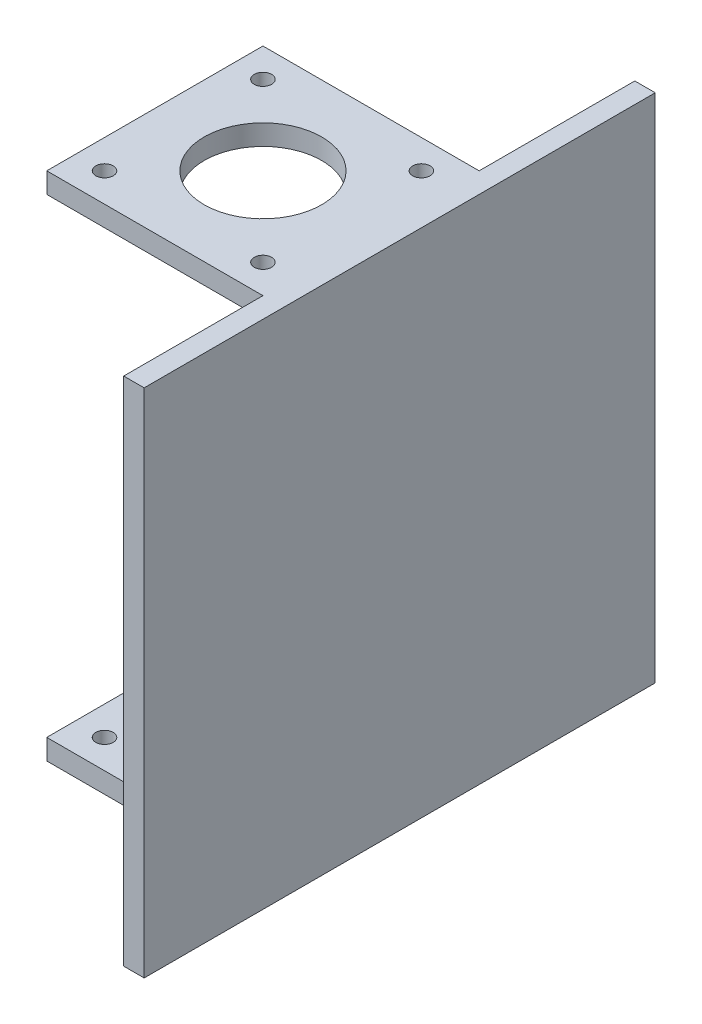
ISO-10303-21;
HEADER;
FILE_DESCRIPTION(('STEP AP214'),'2;1');
FILE_NAME('part.step','',(''),(''),'','','');
FILE_SCHEMA(('AUTOMOTIVE_DESIGN { 1 0 10303 214 1 1 1 1 }'));
ENDSEC;
DATA;
#1=APPLICATION_CONTEXT('core data for automotive mechanical design processes');
#2=APPLICATION_PROTOCOL_DEFINITION('international standard','automotive_design',2000,#1);
#3=PRODUCT_CONTEXT('',#1,'mechanical');
#4=PRODUCT('Part','Part','',(#3));
#5=PRODUCT_RELATED_PRODUCT_CATEGORY('part','',(#4));
#6=PRODUCT_DEFINITION_FORMATION('','',#4);
#7=PRODUCT_DEFINITION_CONTEXT('part definition',#1,'design');
#8=PRODUCT_DEFINITION('design','',#6,#7);
#9=PRODUCT_DEFINITION_SHAPE('','',#8);
#10=(LENGTH_UNIT() NAMED_UNIT(*) SI_UNIT(.MILLI.,.METRE.));
#11=(NAMED_UNIT(*) PLANE_ANGLE_UNIT() SI_UNIT($,.RADIAN.));
#12=(NAMED_UNIT(*) SI_UNIT($,.STERADIAN.) SOLID_ANGLE_UNIT());
#13=UNCERTAINTY_MEASURE_WITH_UNIT(LENGTH_MEASURE(1.E-05),#10,'distance_accuracy_value','');
#14=(GEOMETRIC_REPRESENTATION_CONTEXT(3) GLOBAL_UNCERTAINTY_ASSIGNED_CONTEXT((#13)) GLOBAL_UNIT_ASSIGNED_CONTEXT((#10,
#11,#12)) REPRESENTATION_CONTEXT('',''));
#15=CARTESIAN_POINT('',(0.,0.,0.));
#16=DIRECTION('',(0.,0.,1.));
#17=DIRECTION('',(1.,0.,0.));
#18=AXIS2_PLACEMENT_3D('',#15,#16,#17);
#19=CARTESIAN_POINT('',(21.15,0.,0.));
#20=DIRECTION('',(1.,0.,0.));
#21=DIRECTION('',(0.,0.,-1.));
#22=AXIS2_PLACEMENT_3D('',#19,#20,#21);
#23=PLANE('',#22);
#24=DIRECTION('',(0.,1.,0.));
#25=VECTOR('',#24,1.);
#26=CARTESIAN_POINT('',(21.15,-96.,21.15));
#27=LINE('',#26,#25);
#28=CARTESIAN_POINT('',(21.15,-96.,21.15));
#29=VERTEX_POINT('',#28);
#30=CARTESIAN_POINT('',(21.15,-92.,21.15));
#31=VERTEX_POINT('',#30);
#32=EDGE_CURVE('E149',#29,#31,#27,.T.);
#33=ORIENTED_EDGE('',*,*,#32,.F.);
#34=DIRECTION('',(0.,0.,-1.));
#35=VECTOR('',#34,1.);
#36=CARTESIAN_POINT('',(21.15,-96.,48.3941402757908));
#37=LINE('',#36,#35);
#38=CARTESIAN_POINT('',(21.15,-96.,48.3941402757908));
#39=VERTEX_POINT('',#38);
#40=EDGE_CURVE('E163',#39,#29,#37,.T.);
#41=ORIENTED_EDGE('',*,*,#40,.F.);
#42=DIRECTION('',(0.,-1.,0.));
#43=VECTOR('',#42,1.);
#44=CARTESIAN_POINT('',(21.15,4.,48.3941402757908));
#45=LINE('',#44,#43);
#46=CARTESIAN_POINT('',(21.15,4.,48.3941402757908));
#47=VERTEX_POINT('',#46);
#48=EDGE_CURVE('E168',#47,#39,#45,.T.);
#49=ORIENTED_EDGE('',*,*,#48,.F.);
#50=DIRECTION('',(0.,0.,1.));
#51=VECTOR('',#50,1.);
#52=CARTESIAN_POINT('',(21.15,4.,48.3941402757908));
#53=LINE('',#52,#51);
#54=CARTESIAN_POINT('',(21.15,4.,21.15));
#55=VERTEX_POINT('',#54);
#56=EDGE_CURVE('E177',#55,#47,#53,.T.);
#57=ORIENTED_EDGE('',*,*,#56,.F.);
#58=DIRECTION('',(0.,-1.,0.));
#59=VECTOR('',#58,1.);
#60=CARTESIAN_POINT('',(21.15,4.,21.15));
#61=LINE('',#60,#59);
#62=CARTESIAN_POINT('',(21.15,0.,21.15));
#63=VERTEX_POINT('',#62);
#64=EDGE_CURVE('E254',#55,#63,#61,.T.);
#65=ORIENTED_EDGE('',*,*,#64,.T.);
#66=DIRECTION('',(0.,0.,-1.));
#67=VECTOR('',#66,1.);
#68=CARTESIAN_POINT('',(21.15,0.,21.15));
#69=LINE('',#68,#67);
#70=CARTESIAN_POINT('',(21.15,0.,-21.15));
#71=VERTEX_POINT('',#70);
#72=EDGE_CURVE('E241',#63,#71,#69,.T.);
#73=ORIENTED_EDGE('',*,*,#72,.T.);
#74=DIRECTION('',(0.,-1.,0.));
#75=VECTOR('',#74,1.);
#76=CARTESIAN_POINT('',(21.15,4.,-21.15));
#77=LINE('',#76,#75);
#78=CARTESIAN_POINT('',(21.15,4.,-21.15));
#79=VERTEX_POINT('',#78);
#80=EDGE_CURVE('E11',#79,#71,#77,.T.);
#81=ORIENTED_EDGE('',*,*,#80,.F.);
#82=CARTESIAN_POINT('',(21.15,4.,-51.6058597242092));
#83=VERTEX_POINT('',#82);
#84=EDGE_CURVE('E183',#83,#79,#53,.T.);
#85=ORIENTED_EDGE('',*,*,#84,.F.);
#86=DIRECTION('',(0.,1.,0.));
#87=VECTOR('',#86,1.);
#88=CARTESIAN_POINT('',(21.15,4.,-51.6058597242092));
#89=LINE('',#88,#87);
#90=CARTESIAN_POINT('',(21.15,-96.,-51.6058597242093));
#91=VERTEX_POINT('',#90);
#92=EDGE_CURVE('E172',#91,#83,#89,.T.);
#93=ORIENTED_EDGE('',*,*,#92,.F.);
#94=CARTESIAN_POINT('',(21.15,-96.,-21.15));
#95=VERTEX_POINT('',#94);
#96=EDGE_CURVE('E174',#95,#91,#37,.T.);
#97=ORIENTED_EDGE('',*,*,#96,.F.);
#98=DIRECTION('',(0.,1.,0.));
#99=VECTOR('',#98,1.);
#100=CARTESIAN_POINT('',(21.15,-96.,-21.15));
#101=LINE('',#100,#99);
#102=CARTESIAN_POINT('',(21.15,-92.,-21.15));
#103=VERTEX_POINT('',#102);
#104=EDGE_CURVE('E297',#95,#103,#101,.T.);
#105=ORIENTED_EDGE('',*,*,#104,.T.);
#106=DIRECTION('',(0.,0.,-1.));
#107=VECTOR('',#106,1.);
#108=CARTESIAN_POINT('',(21.15,-92.,21.15));
#109=LINE('',#108,#107);
#110=EDGE_CURVE('E165',#31,#103,#109,.T.);
#111=ORIENTED_EDGE('',*,*,#110,.F.);
#112=EDGE_LOOP('',(#33,#41,#49,#57,#65,#73,#81,#85,#93,#97,#105,#111));
#113=FACE_BOUND('',#112,.T.);
#114=ADVANCED_FACE('F44',(#113),#23,.F.);
#115=CARTESIAN_POINT('',(0.,4.,0.));
#116=DIRECTION('',(0.,-1.,0.));
#117=DIRECTION('',(0.,0.,-1.));
#118=AXIS2_PLACEMENT_3D('',#115,#116,#117);
#119=PLANE('',#118);
#120=DIRECTION('',(1.,0.,0.));
#121=VECTOR('',#120,1.);
#122=CARTESIAN_POINT('',(-21.15,4.,21.15));
#123=LINE('',#122,#121);
#124=CARTESIAN_POINT('',(-21.15,4.,21.15));
#125=VERTEX_POINT('',#124);
#126=EDGE_CURVE('E69',#125,#55,#123,.T.);
#127=ORIENTED_EDGE('',*,*,#126,.T.);
#128=ORIENTED_EDGE('',*,*,#56,.T.);
#129=DIRECTION('',(-1.,0.,0.));
#130=VECTOR('',#129,1.);
#131=CARTESIAN_POINT('',(25.15,4.,48.3941402757908));
#132=LINE('',#131,#130);
#133=CARTESIAN_POINT('',(25.15,4.,48.3941402757908));
#134=VERTEX_POINT('',#133);
#135=EDGE_CURVE('E186',#134,#47,#132,.T.);
#136=ORIENTED_EDGE('',*,*,#135,.F.);
#137=DIRECTION('',(0.,0.,1.));
#138=VECTOR('',#137,1.);
#139=CARTESIAN_POINT('',(25.15,4.,48.3941402757908));
#140=LINE('',#139,#138);
#141=CARTESIAN_POINT('',(25.15,4.,-51.6058597242092));
#142=VERTEX_POINT('',#141);
#143=EDGE_CURVE('E191',#142,#134,#140,.T.);
#144=ORIENTED_EDGE('',*,*,#143,.F.);
#145=DIRECTION('',(-1.,0.,0.));
#146=VECTOR('',#145,1.);
#147=CARTESIAN_POINT('',(25.15,4.,-51.6058597242092));
#148=LINE('',#147,#146);
#149=EDGE_CURVE('E194',#142,#83,#148,.T.);
#150=ORIENTED_EDGE('',*,*,#149,.T.);
#151=ORIENTED_EDGE('',*,*,#84,.T.);
#152=DIRECTION('',(-1.,0.,0.));
#153=VECTOR('',#152,1.);
#154=CARTESIAN_POINT('',(-21.15,4.,-21.15));
#155=LINE('',#154,#153);
#156=CARTESIAN_POINT('',(-21.15,4.,-21.15));
#157=VERTEX_POINT('',#156);
#158=EDGE_CURVE('E98',#79,#157,#155,.T.);
#159=ORIENTED_EDGE('',*,*,#158,.T.);
#160=DIRECTION('',(0.,0.,1.));
#161=VECTOR('',#160,1.);
#162=CARTESIAN_POINT('',(-21.15,4.,21.15));
#163=LINE('',#162,#161);
#164=EDGE_CURVE('E250',#157,#125,#163,.T.);
#165=ORIENTED_EDGE('',*,*,#164,.T.);
#166=EDGE_LOOP('',(#127,#128,#136,#144,#150,#151,#159,#165));
#167=FACE_BOUND('',#166,.T.);
#168=CARTESIAN_POINT('',(-15.5,4.,-15.5));
#169=DIRECTION('',(0.,1.,0.));
#170=DIRECTION('',(0.,0.,1.));
#171=AXIS2_PLACEMENT_3D('',#168,#169,#170);
#172=CIRCLE('',#171,1.7);
#173=CARTESIAN_POINT('',(-15.5,4.,-13.8));
#174=VERTEX_POINT('',#173);
#175=EDGE_CURVE('E240',#174,#174,#172,.T.);
#176=ORIENTED_EDGE('',*,*,#175,.F.);
#177=EDGE_LOOP('',(#176));
#178=FACE_BOUND('',#177,.T.);
#179=CARTESIAN_POINT('',(15.5,4.,-15.5));
#180=DIRECTION('',(0.,1.,0.));
#181=DIRECTION('',(0.,0.,1.));
#182=AXIS2_PLACEMENT_3D('',#179,#180,#181);
#183=CIRCLE('',#182,1.7);
#184=CARTESIAN_POINT('',(15.5,4.,-13.8));
#185=VERTEX_POINT('',#184);
#186=EDGE_CURVE('E230',#185,#185,#183,.T.);
#187=ORIENTED_EDGE('',*,*,#186,.F.);
#188=EDGE_LOOP('',(#187));
#189=FACE_BOUND('',#188,.T.);
#190=CARTESIAN_POINT('',(15.5,4.,15.5));
#191=DIRECTION('',(0.,1.,0.));
#192=DIRECTION('',(0.,0.,1.));
#193=AXIS2_PLACEMENT_3D('',#190,#191,#192);
#194=CIRCLE('',#193,1.7);
#195=CARTESIAN_POINT('',(15.5,4.,17.2));
#196=VERTEX_POINT('',#195);
#197=EDGE_CURVE('E222',#196,#196,#194,.T.);
#198=ORIENTED_EDGE('',*,*,#197,.F.);
#199=EDGE_LOOP('',(#198));
#200=FACE_BOUND('',#199,.T.);
#201=CARTESIAN_POINT('',(-15.5,4.,15.5));
#202=DIRECTION('',(0.,1.,0.));
#203=DIRECTION('',(0.,0.,1.));
#204=AXIS2_PLACEMENT_3D('',#201,#202,#203);
#205=CIRCLE('',#204,1.7);
#206=CARTESIAN_POINT('',(-15.5,4.,17.2));
#207=VERTEX_POINT('',#206);
#208=EDGE_CURVE('E214',#207,#207,#205,.T.);
#209=ORIENTED_EDGE('',*,*,#208,.F.);
#210=EDGE_LOOP('',(#209));
#211=FACE_BOUND('',#210,.T.);
#212=CARTESIAN_POINT('',(0.,4.,0.));
#213=DIRECTION('',(0.,1.,0.));
#214=DIRECTION('',(0.,0.,1.));
#215=AXIS2_PLACEMENT_3D('',#212,#213,#214);
#216=CIRCLE('',#215,11.5);
#217=CARTESIAN_POINT('',(0.,4.,11.5));
#218=VERTEX_POINT('',#217);
#219=EDGE_CURVE('E201',#218,#218,#216,.T.);
#220=ORIENTED_EDGE('',*,*,#219,.F.);
#221=EDGE_LOOP('',(#220));
#222=FACE_BOUND('',#221,.T.);
#223=ADVANCED_FACE('F398',(#167,#178,#189,#200,#211,#222),#119,.F.);
#224=CARTESIAN_POINT('',(0.,0.,0.));
#225=DIRECTION('',(0.,-1.,0.));
#226=DIRECTION('',(0.,0.,-1.));
#227=AXIS2_PLACEMENT_3D('',#224,#225,#226);
#228=PLANE('',#227);
#229=CARTESIAN_POINT('',(-15.5,0.,15.5));
#230=DIRECTION('',(0.,1.,0.));
#231=DIRECTION('',(0.,0.,1.));
#232=AXIS2_PLACEMENT_3D('',#229,#230,#231);
#233=CIRCLE('',#232,1.7);
#234=CARTESIAN_POINT('',(-15.5,0.,17.2));
#235=VERTEX_POINT('',#234);
#236=EDGE_CURVE('E209',#235,#235,#233,.T.);
#237=ORIENTED_EDGE('',*,*,#236,.T.);
#238=EDGE_LOOP('',(#237));
#239=FACE_BOUND('',#238,.T.);
#240=CARTESIAN_POINT('',(15.5,0.,-15.5));
#241=DIRECTION('',(0.,1.,0.));
#242=DIRECTION('',(0.,0.,1.));
#243=AXIS2_PLACEMENT_3D('',#240,#241,#242);
#244=CIRCLE('',#243,1.7);
#245=CARTESIAN_POINT('',(15.5,0.,-13.8));
#246=VERTEX_POINT('',#245);
#247=EDGE_CURVE('E221',#246,#246,#244,.T.);
#248=ORIENTED_EDGE('',*,*,#247,.T.);
#249=EDGE_LOOP('',(#248));
#250=FACE_BOUND('',#249,.T.);
#251=ORIENTED_EDGE('',*,*,#72,.F.);
#252=DIRECTION('',(1.,0.,0.));
#253=VECTOR('',#252,1.);
#254=CARTESIAN_POINT('',(-21.15,0.,21.15));
#255=LINE('',#254,#253);
#256=CARTESIAN_POINT('',(-21.15,0.,21.15));
#257=VERTEX_POINT('',#256);
#258=EDGE_CURVE('E247',#257,#63,#255,.T.);
#259=ORIENTED_EDGE('',*,*,#258,.F.);
#260=DIRECTION('',(0.,0.,1.));
#261=VECTOR('',#260,1.);
#262=CARTESIAN_POINT('',(-21.15,0.,21.15));
#263=LINE('',#262,#261);
#264=CARTESIAN_POINT('',(-21.15,0.,-21.15));
#265=VERTEX_POINT('',#264);
#266=EDGE_CURVE('E87',#265,#257,#263,.T.);
#267=ORIENTED_EDGE('',*,*,#266,.F.);
#268=DIRECTION('',(-1.,0.,0.));
#269=VECTOR('',#268,1.);
#270=CARTESIAN_POINT('',(-21.15,0.,-21.15));
#271=LINE('',#270,#269);
#272=EDGE_CURVE('E260',#71,#265,#271,.T.);
#273=ORIENTED_EDGE('',*,*,#272,.F.);
#274=EDGE_LOOP('',(#251,#259,#267,#273));
#275=FACE_BOUND('',#274,.T.);
#276=CARTESIAN_POINT('',(-15.5,0.,-15.5));
#277=DIRECTION('',(0.,1.,0.));
#278=DIRECTION('',(0.,0.,1.));
#279=AXIS2_PLACEMENT_3D('',#276,#277,#278);
#280=CIRCLE('',#279,1.7);
#281=CARTESIAN_POINT('',(-15.5,0.,-13.8));
#282=VERTEX_POINT('',#281);
#283=EDGE_CURVE('E231',#282,#282,#280,.T.);
#284=ORIENTED_EDGE('',*,*,#283,.T.);
#285=EDGE_LOOP('',(#284));
#286=FACE_BOUND('',#285,.T.);
#287=CARTESIAN_POINT('',(15.5,0.,15.5));
#288=DIRECTION('',(0.,1.,0.));
#289=DIRECTION('',(0.,0.,1.));
#290=AXIS2_PLACEMENT_3D('',#287,#288,#289);
#291=CIRCLE('',#290,1.7);
#292=CARTESIAN_POINT('',(15.5,0.,17.2));
#293=VERTEX_POINT('',#292);
#294=EDGE_CURVE('E220',#293,#293,#291,.T.);
#295=ORIENTED_EDGE('',*,*,#294,.T.);
#296=EDGE_LOOP('',(#295));
#297=FACE_BOUND('',#296,.T.);
#298=CARTESIAN_POINT('',(0.,0.,0.));
#299=DIRECTION('',(0.,1.,0.));
#300=DIRECTION('',(0.,0.,1.));
#301=AXIS2_PLACEMENT_3D('',#298,#299,#300);
#302=CIRCLE('',#301,11.5);
#303=CARTESIAN_POINT('',(0.,0.,11.5));
#304=VERTEX_POINT('',#303);
#305=EDGE_CURVE('E204',#304,#304,#302,.T.);
#306=ORIENTED_EDGE('',*,*,#305,.T.);
#307=EDGE_LOOP('',(#306));
#308=FACE_BOUND('',#307,.T.);
#309=ADVANCED_FACE('F273',(#239,#250,#275,#286,#297,#308),#228,.T.);
#310=CARTESIAN_POINT('',(-21.15,4.,-21.15));
#311=DIRECTION('',(0.,0.,1.));
#312=DIRECTION('',(1.,0.,0.));
#313=AXIS2_PLACEMENT_3D('',#310,#311,#312);
#314=PLANE('',#313);
#315=ORIENTED_EDGE('',*,*,#272,.T.);
#316=DIRECTION('',(0.,-1.,0.));
#317=VECTOR('',#316,1.);
#318=CARTESIAN_POINT('',(-21.15,4.,-21.15));
#319=LINE('',#318,#317);
#320=EDGE_CURVE('E53',#157,#265,#319,.T.);
#321=ORIENTED_EDGE('',*,*,#320,.F.);
#322=ORIENTED_EDGE('',*,*,#158,.F.);
#323=ORIENTED_EDGE('',*,*,#80,.T.);
#324=EDGE_LOOP('',(#315,#321,#322,#323));
#325=FACE_BOUND('',#324,.T.);
#326=ADVANCED_FACE('F50',(#325),#314,.F.);
#327=CARTESIAN_POINT('',(-21.15,4.,21.15));
#328=DIRECTION('',(1.,0.,0.));
#329=DIRECTION('',(0.,0.,-1.));
#330=AXIS2_PLACEMENT_3D('',#327,#328,#329);
#331=PLANE('',#330);
#332=ORIENTED_EDGE('',*,*,#266,.T.);
#333=DIRECTION('',(0.,-1.,0.));
#334=VECTOR('',#333,1.);
#335=CARTESIAN_POINT('',(-21.15,4.,21.15));
#336=LINE('',#335,#334);
#337=EDGE_CURVE('E268',#125,#257,#336,.T.);
#338=ORIENTED_EDGE('',*,*,#337,.F.);
#339=ORIENTED_EDGE('',*,*,#164,.F.);
#340=ORIENTED_EDGE('',*,*,#320,.T.);
#341=EDGE_LOOP('',(#332,#338,#339,#340));
#342=FACE_BOUND('',#341,.T.);
#343=ADVANCED_FACE('F275',(#342),#331,.F.);
#344=CARTESIAN_POINT('',(-21.15,4.,21.15));
#345=DIRECTION('',(0.,0.,-1.));
#346=DIRECTION('',(-1.,0.,0.));
#347=AXIS2_PLACEMENT_3D('',#344,#345,#346);
#348=PLANE('',#347);
#349=ORIENTED_EDGE('',*,*,#258,.T.);
#350=ORIENTED_EDGE('',*,*,#64,.F.);
#351=ORIENTED_EDGE('',*,*,#126,.F.);
#352=ORIENTED_EDGE('',*,*,#337,.T.);
#353=EDGE_LOOP('',(#349,#350,#351,#352));
#354=FACE_BOUND('',#353,.T.);
#355=ADVANCED_FACE('F279',(#354),#348,.F.);
#356=CARTESIAN_POINT('',(-15.5,4.,-15.5));
#357=DIRECTION('',(0.,-1.,0.));
#358=DIRECTION('',(0.,0.,-1.));
#359=AXIS2_PLACEMENT_3D('',#356,#357,#358);
#360=CYLINDRICAL_SURFACE('',#359,1.7);
#361=ORIENTED_EDGE('',*,*,#175,.T.);
#362=EDGE_LOOP('',(#361));
#363=FACE_BOUND('',#362,.T.);
#364=ORIENTED_EDGE('',*,*,#283,.F.);
#365=EDGE_LOOP('',(#364));
#366=FACE_BOUND('',#365,.T.);
#367=ADVANCED_FACE('F437',(#363,#366),#360,.F.);
#368=CARTESIAN_POINT('',(15.5,4.,-15.5));
#369=DIRECTION('',(0.,-1.,0.));
#370=DIRECTION('',(0.,0.,-1.));
#371=AXIS2_PLACEMENT_3D('',#368,#369,#370);
#372=CYLINDRICAL_SURFACE('',#371,1.7);
#373=ORIENTED_EDGE('',*,*,#186,.T.);
#374=EDGE_LOOP('',(#373));
#375=FACE_BOUND('',#374,.T.);
#376=ORIENTED_EDGE('',*,*,#247,.F.);
#377=EDGE_LOOP('',(#376));
#378=FACE_BOUND('',#377,.T.);
#379=ADVANCED_FACE('F434',(#375,#378),#372,.F.);
#380=CARTESIAN_POINT('',(15.5,4.,15.5));
#381=DIRECTION('',(0.,-1.,0.));
#382=DIRECTION('',(0.,0.,-1.));
#383=AXIS2_PLACEMENT_3D('',#380,#381,#382);
#384=CYLINDRICAL_SURFACE('',#383,1.7);
#385=ORIENTED_EDGE('',*,*,#197,.T.);
#386=EDGE_LOOP('',(#385));
#387=FACE_BOUND('',#386,.T.);
#388=ORIENTED_EDGE('',*,*,#294,.F.);
#389=EDGE_LOOP('',(#388));
#390=FACE_BOUND('',#389,.T.);
#391=ADVANCED_FACE('F431',(#387,#390),#384,.F.);
#392=CARTESIAN_POINT('',(-15.5,4.,15.5));
#393=DIRECTION('',(0.,-1.,0.));
#394=DIRECTION('',(0.,0.,-1.));
#395=AXIS2_PLACEMENT_3D('',#392,#393,#394);
#396=CYLINDRICAL_SURFACE('',#395,1.7);
#397=ORIENTED_EDGE('',*,*,#208,.T.);
#398=EDGE_LOOP('',(#397));
#399=FACE_BOUND('',#398,.T.);
#400=ORIENTED_EDGE('',*,*,#236,.F.);
#401=EDGE_LOOP('',(#400));
#402=FACE_BOUND('',#401,.T.);
#403=ADVANCED_FACE('F430',(#399,#402),#396,.F.);
#404=CARTESIAN_POINT('',(0.,4.,0.));
#405=DIRECTION('',(0.,-1.,0.));
#406=DIRECTION('',(0.,0.,-1.));
#407=AXIS2_PLACEMENT_3D('',#404,#405,#406);
#408=CYLINDRICAL_SURFACE('',#407,11.5);
#409=ORIENTED_EDGE('',*,*,#219,.T.);
#410=EDGE_LOOP('',(#409));
#411=FACE_BOUND('',#410,.T.);
#412=ORIENTED_EDGE('',*,*,#305,.F.);
#413=EDGE_LOOP('',(#412));
#414=FACE_BOUND('',#413,.T.);
#415=ADVANCED_FACE('F425',(#411,#414),#408,.F.);
#416=CARTESIAN_POINT('',(25.15,4.,48.3941402757908));
#417=DIRECTION('',(0.,0.,-1.));
#418=DIRECTION('',(0.,1.,0.));
#419=AXIS2_PLACEMENT_3D('',#416,#417,#418);
#420=PLANE('',#419);
#421=ORIENTED_EDGE('',*,*,#48,.T.);
#422=DIRECTION('',(-1.,0.,0.));
#423=VECTOR('',#422,1.);
#424=CARTESIAN_POINT('',(25.15,-96.,48.3941402757908));
#425=LINE('',#424,#423);
#426=CARTESIAN_POINT('',(25.15,-96.,48.3941402757908));
#427=VERTEX_POINT('',#426);
#428=EDGE_CURVE('E171',#427,#39,#425,.T.);
#429=ORIENTED_EDGE('',*,*,#428,.F.);
#430=DIRECTION('',(0.,-1.,0.));
#431=VECTOR('',#430,1.);
#432=CARTESIAN_POINT('',(25.15,4.,48.3941402757908));
#433=LINE('',#432,#431);
#434=EDGE_CURVE('E189',#134,#427,#433,.T.);
#435=ORIENTED_EDGE('',*,*,#434,.F.);
#436=ORIENTED_EDGE('',*,*,#135,.T.);
#437=EDGE_LOOP('',(#421,#429,#435,#436));
#438=FACE_BOUND('',#437,.T.);
#439=ADVANCED_FACE('F397',(#438),#420,.F.);
#440=CARTESIAN_POINT('',(25.15,-96.,48.3941402757908));
#441=DIRECTION('',(0.,1.,0.));
#442=DIRECTION('',(0.,0.,1.));
#443=AXIS2_PLACEMENT_3D('',#440,#441,#442);
#444=PLANE('',#443);
#445=ORIENTED_EDGE('',*,*,#40,.T.);
#446=DIRECTION('',(1.,0.,0.));
#447=VECTOR('',#446,1.);
#448=CARTESIAN_POINT('',(-21.15,-96.,21.15));
#449=LINE('',#448,#447);
#450=CARTESIAN_POINT('',(-21.15,-96.,21.15));
#451=VERTEX_POINT('',#450);
#452=EDGE_CURVE('E143',#451,#29,#449,.T.);
#453=ORIENTED_EDGE('',*,*,#452,.F.);
#454=DIRECTION('',(0.,0.,1.));
#455=VECTOR('',#454,1.);
#456=CARTESIAN_POINT('',(-21.15,-96.,21.15));
#457=LINE('',#456,#455);
#458=CARTESIAN_POINT('',(-21.15,-96.,-21.15));
#459=VERTEX_POINT('',#458);
#460=EDGE_CURVE('E157',#459,#451,#457,.T.);
#461=ORIENTED_EDGE('',*,*,#460,.F.);
#462=DIRECTION('',(-1.,0.,0.));
#463=VECTOR('',#462,1.);
#464=CARTESIAN_POINT('',(-21.15,-96.,-21.15));
#465=LINE('',#464,#463);
#466=EDGE_CURVE('E303',#95,#459,#465,.T.);
#467=ORIENTED_EDGE('',*,*,#466,.F.);
#468=ORIENTED_EDGE('',*,*,#96,.T.);
#469=DIRECTION('',(-1.,0.,0.));
#470=VECTOR('',#469,1.);
#471=CARTESIAN_POINT('',(25.15,-96.,-51.6058597242093));
#472=LINE('',#471,#470);
#473=CARTESIAN_POINT('',(25.15,-96.,-51.6058597242093));
#474=VERTEX_POINT('',#473);
#475=EDGE_CURVE('E198',#474,#91,#472,.T.);
#476=ORIENTED_EDGE('',*,*,#475,.F.);
#477=DIRECTION('',(0.,0.,-1.));
#478=VECTOR('',#477,1.);
#479=CARTESIAN_POINT('',(25.15,-96.,48.3941402757908));
#480=LINE('',#479,#478);
#481=EDGE_CURVE('E284',#427,#474,#480,.T.);
#482=ORIENTED_EDGE('',*,*,#481,.F.);
#483=ORIENTED_EDGE('',*,*,#428,.T.);
#484=EDGE_LOOP('',(#445,#453,#461,#467,#468,#476,#482,#483));
#485=FACE_BOUND('',#484,.T.);
#486=CARTESIAN_POINT('',(0.,-96.,0.));
#487=DIRECTION('',(0.,1.,0.));
#488=DIRECTION('',(0.,0.,1.));
#489=AXIS2_PLACEMENT_3D('',#486,#487,#488);
#490=CIRCLE('',#489,11.5);
#491=CARTESIAN_POINT('',(0.,-96.,11.5));
#492=VERTEX_POINT('',#491);
#493=EDGE_CURVE('E348',#492,#492,#490,.T.);
#494=ORIENTED_EDGE('',*,*,#493,.T.);
#495=EDGE_LOOP('',(#494));
#496=FACE_BOUND('',#495,.T.);
#497=CARTESIAN_POINT('',(-15.5,-96.,15.5));
#498=DIRECTION('',(0.,1.,0.));
#499=DIRECTION('',(0.,0.,1.));
#500=AXIS2_PLACEMENT_3D('',#497,#498,#499);
#501=CIRCLE('',#500,1.7);
#502=CARTESIAN_POINT('',(-15.5,-96.,17.2));
#503=VERTEX_POINT('',#502);
#504=EDGE_CURVE('E338',#503,#503,#501,.T.);
#505=ORIENTED_EDGE('',*,*,#504,.T.);
#506=EDGE_LOOP('',(#505));
#507=FACE_BOUND('',#506,.T.);
#508=CARTESIAN_POINT('',(15.5,-96.,15.5));
#509=DIRECTION('',(0.,1.,0.));
#510=DIRECTION('',(0.,0.,1.));
#511=AXIS2_PLACEMENT_3D('',#508,#509,#510);
#512=CIRCLE('',#511,1.7);
#513=CARTESIAN_POINT('',(15.5,-96.,17.2));
#514=VERTEX_POINT('',#513);
#515=EDGE_CURVE('E335',#514,#514,#512,.T.);
#516=ORIENTED_EDGE('',*,*,#515,.T.);
#517=EDGE_LOOP('',(#516));
#518=FACE_BOUND('',#517,.T.);
#519=CARTESIAN_POINT('',(15.5,-96.,-15.5));
#520=DIRECTION('',(0.,1.,0.));
#521=DIRECTION('',(0.,0.,1.));
#522=AXIS2_PLACEMENT_3D('',#519,#520,#521);
#523=CIRCLE('',#522,1.7);
#524=CARTESIAN_POINT('',(15.5,-96.,-13.8));
#525=VERTEX_POINT('',#524);
#526=EDGE_CURVE('E321',#525,#525,#523,.T.);
#527=ORIENTED_EDGE('',*,*,#526,.T.);
#528=EDGE_LOOP('',(#527));
#529=FACE_BOUND('',#528,.T.);
#530=CARTESIAN_POINT('',(-15.5,-96.,-15.5));
#531=DIRECTION('',(0.,1.,0.));
#532=DIRECTION('',(0.,0.,1.));
#533=AXIS2_PLACEMENT_3D('',#530,#531,#532);
#534=CIRCLE('',#533,1.7);
#535=CARTESIAN_POINT('',(-15.5,-96.,-13.8));
#536=VERTEX_POINT('',#535);
#537=EDGE_CURVE('E313',#536,#536,#534,.T.);
#538=ORIENTED_EDGE('',*,*,#537,.T.);
#539=EDGE_LOOP('',(#538));
#540=FACE_BOUND('',#539,.T.);
#541=ADVANCED_FACE('F166',(#485,#496,#507,#518,#529,#540),#444,.F.);
#542=CARTESIAN_POINT('',(25.15,4.,-51.6058597242092));
#543=DIRECTION('',(0.,0.,1.));
#544=DIRECTION('',(0.,-1.,0.));
#545=AXIS2_PLACEMENT_3D('',#542,#543,#544);
#546=PLANE('',#545);
#547=ORIENTED_EDGE('',*,*,#92,.T.);
#548=ORIENTED_EDGE('',*,*,#149,.F.);
#549=DIRECTION('',(0.,1.,0.));
#550=VECTOR('',#549,1.);
#551=CARTESIAN_POINT('',(25.15,4.,-51.6058597242092));
#552=LINE('',#551,#550);
#553=EDGE_CURVE('E288',#474,#142,#552,.T.);
#554=ORIENTED_EDGE('',*,*,#553,.F.);
#555=ORIENTED_EDGE('',*,*,#475,.T.);
#556=EDGE_LOOP('',(#547,#548,#554,#555));
#557=FACE_BOUND('',#556,.T.);
#558=ADVANCED_FACE('F391',(#557),#546,.F.);
#559=CARTESIAN_POINT('',(25.15,0.,0.));
#560=DIRECTION('',(1.,0.,0.));
#561=DIRECTION('',(0.,0.,-1.));
#562=AXIS2_PLACEMENT_3D('',#559,#560,#561);
#563=PLANE('',#562);
#564=ORIENTED_EDGE('',*,*,#434,.T.);
#565=ORIENTED_EDGE('',*,*,#481,.T.);
#566=ORIENTED_EDGE('',*,*,#553,.T.);
#567=ORIENTED_EDGE('',*,*,#143,.T.);
#568=EDGE_LOOP('',(#564,#565,#566,#567));
#569=FACE_BOUND('',#568,.T.);
#570=ADVANCED_FACE('F393',(#569),#563,.T.);
#571=CARTESIAN_POINT('',(-21.15,-96.,21.15));
#572=DIRECTION('',(0.,0.,1.));
#573=DIRECTION('',(1.,0.,0.));
#574=AXIS2_PLACEMENT_3D('',#571,#572,#573);
#575=PLANE('',#574);
#576=DIRECTION('',(1.,0.,0.));
#577=VECTOR('',#576,1.);
#578=CARTESIAN_POINT('',(-21.15,-92.,21.15));
#579=LINE('',#578,#577);
#580=CARTESIAN_POINT('',(-21.15,-92.,21.15));
#581=VERTEX_POINT('',#580);
#582=EDGE_CURVE('E62',#581,#31,#579,.T.);
#583=ORIENTED_EDGE('',*,*,#582,.F.);
#584=DIRECTION('',(0.,1.,0.));
#585=VECTOR('',#584,1.);
#586=CARTESIAN_POINT('',(-21.15,-96.,21.15));
#587=LINE('',#586,#585);
#588=EDGE_CURVE('E148',#451,#581,#587,.T.);
#589=ORIENTED_EDGE('',*,*,#588,.F.);
#590=ORIENTED_EDGE('',*,*,#452,.T.);
#591=ORIENTED_EDGE('',*,*,#32,.T.);
#592=EDGE_LOOP('',(#583,#589,#590,#591));
#593=FACE_BOUND('',#592,.T.);
#594=ADVANCED_FACE('F150',(#593),#575,.T.);
#595=CARTESIAN_POINT('',(-21.15,-96.,21.15));
#596=DIRECTION('',(-1.,0.,0.));
#597=DIRECTION('',(0.,0.,1.));
#598=AXIS2_PLACEMENT_3D('',#595,#596,#597);
#599=PLANE('',#598);
#600=DIRECTION('',(0.,0.,1.));
#601=VECTOR('',#600,1.);
#602=CARTESIAN_POINT('',(-21.15,-92.,21.15));
#603=LINE('',#602,#601);
#604=CARTESIAN_POINT('',(-21.15,-92.,-21.15));
#605=VERTEX_POINT('',#604);
#606=EDGE_CURVE('E310',#605,#581,#603,.T.);
#607=ORIENTED_EDGE('',*,*,#606,.F.);
#608=DIRECTION('',(0.,1.,0.));
#609=VECTOR('',#608,1.);
#610=CARTESIAN_POINT('',(-21.15,-96.,-21.15));
#611=LINE('',#610,#609);
#612=EDGE_CURVE('E300',#459,#605,#611,.T.);
#613=ORIENTED_EDGE('',*,*,#612,.F.);
#614=ORIENTED_EDGE('',*,*,#460,.T.);
#615=ORIENTED_EDGE('',*,*,#588,.T.);
#616=EDGE_LOOP('',(#607,#613,#614,#615));
#617=FACE_BOUND('',#616,.T.);
#618=ADVANCED_FACE('F488',(#617),#599,.T.);
#619=CARTESIAN_POINT('',(-21.15,-96.,-21.15));
#620=DIRECTION('',(0.,0.,-1.));
#621=DIRECTION('',(-1.,0.,0.));
#622=AXIS2_PLACEMENT_3D('',#619,#620,#621);
#623=PLANE('',#622);
#624=DIRECTION('',(-1.,0.,0.));
#625=VECTOR('',#624,1.);
#626=CARTESIAN_POINT('',(-21.15,-92.,-21.15));
#627=LINE('',#626,#625);
#628=EDGE_CURVE('E160',#103,#605,#627,.T.);
#629=ORIENTED_EDGE('',*,*,#628,.F.);
#630=ORIENTED_EDGE('',*,*,#104,.F.);
#631=ORIENTED_EDGE('',*,*,#466,.T.);
#632=ORIENTED_EDGE('',*,*,#612,.T.);
#633=EDGE_LOOP('',(#629,#630,#631,#632));
#634=FACE_BOUND('',#633,.T.);
#635=ADVANCED_FACE('F375',(#634),#623,.T.);
#636=CARTESIAN_POINT('',(0.,-92.,0.));
#637=DIRECTION('',(0.,1.,0.));
#638=DIRECTION('',(0.,0.,-1.));
#639=AXIS2_PLACEMENT_3D('',#636,#637,#638);
#640=PLANE('',#639);
#641=CARTESIAN_POINT('',(0.,-92.,0.));
#642=DIRECTION('',(0.,1.,0.));
#643=DIRECTION('',(0.,0.,1.));
#644=AXIS2_PLACEMENT_3D('',#641,#642,#643);
#645=CIRCLE('',#644,11.5);
#646=CARTESIAN_POINT('',(0.,-92.,11.5));
#647=VERTEX_POINT('',#646);
#648=EDGE_CURVE('E355',#647,#647,#645,.T.);
#649=ORIENTED_EDGE('',*,*,#648,.F.);
#650=EDGE_LOOP('',(#649));
#651=FACE_BOUND('',#650,.T.);
#652=CARTESIAN_POINT('',(-15.5,-92.,15.5));
#653=DIRECTION('',(0.,1.,0.));
#654=DIRECTION('',(0.,0.,1.));
#655=AXIS2_PLACEMENT_3D('',#652,#653,#654);
#656=CIRCLE('',#655,1.7);
#657=CARTESIAN_POINT('',(-15.5,-92.,17.2));
#658=VERTEX_POINT('',#657);
#659=EDGE_CURVE('E341',#658,#658,#656,.T.);
#660=ORIENTED_EDGE('',*,*,#659,.F.);
#661=EDGE_LOOP('',(#660));
#662=FACE_BOUND('',#661,.T.);
#663=CARTESIAN_POINT('',(15.5,-92.,15.5));
#664=DIRECTION('',(0.,1.,0.));
#665=DIRECTION('',(0.,0.,1.));
#666=AXIS2_PLACEMENT_3D('',#663,#664,#665);
#667=CIRCLE('',#666,1.7);
#668=CARTESIAN_POINT('',(15.5,-92.,17.2));
#669=VERTEX_POINT('',#668);
#670=EDGE_CURVE('E337',#669,#669,#667,.T.);
#671=ORIENTED_EDGE('',*,*,#670,.F.);
#672=EDGE_LOOP('',(#671));
#673=FACE_BOUND('',#672,.T.);
#674=CARTESIAN_POINT('',(15.5,-92.,-15.5));
#675=DIRECTION('',(0.,1.,0.));
#676=DIRECTION('',(0.,0.,1.));
#677=AXIS2_PLACEMENT_3D('',#674,#675,#676);
#678=CIRCLE('',#677,1.7);
#679=CARTESIAN_POINT('',(15.5,-92.,-13.8));
#680=VERTEX_POINT('',#679);
#681=EDGE_CURVE('E328',#680,#680,#678,.T.);
#682=ORIENTED_EDGE('',*,*,#681,.F.);
#683=EDGE_LOOP('',(#682));
#684=FACE_BOUND('',#683,.T.);
#685=CARTESIAN_POINT('',(-15.5,-92.,-15.5));
#686=DIRECTION('',(0.,1.,0.));
#687=DIRECTION('',(0.,0.,1.));
#688=AXIS2_PLACEMENT_3D('',#685,#686,#687);
#689=CIRCLE('',#688,1.7);
#690=CARTESIAN_POINT('',(-15.5,-92.,-13.8));
#691=VERTEX_POINT('',#690);
#692=EDGE_CURVE('E318',#691,#691,#689,.T.);
#693=ORIENTED_EDGE('',*,*,#692,.F.);
#694=EDGE_LOOP('',(#693));
#695=FACE_BOUND('',#694,.T.);
#696=ORIENTED_EDGE('',*,*,#110,.T.);
#697=ORIENTED_EDGE('',*,*,#628,.T.);
#698=ORIENTED_EDGE('',*,*,#606,.T.);
#699=ORIENTED_EDGE('',*,*,#582,.T.);
#700=EDGE_LOOP('',(#696,#697,#698,#699));
#701=FACE_BOUND('',#700,.T.);
#702=ADVANCED_FACE('F368',(#651,#662,#673,#684,#695,#701),#640,.T.);
#703=CARTESIAN_POINT('',(-15.5,-96.,-15.5));
#704=DIRECTION('',(0.,1.,0.));
#705=DIRECTION('',(0.,0.,1.));
#706=AXIS2_PLACEMENT_3D('',#703,#704,#705);
#707=CYLINDRICAL_SURFACE('',#706,1.7);
#708=ORIENTED_EDGE('',*,*,#537,.F.);
#709=EDGE_LOOP('',(#708));
#710=FACE_BOUND('',#709,.T.);
#711=ORIENTED_EDGE('',*,*,#692,.T.);
#712=EDGE_LOOP('',(#711));
#713=FACE_BOUND('',#712,.T.);
#714=ADVANCED_FACE('F371',(#710,#713),#707,.F.);
#715=CARTESIAN_POINT('',(15.5,-96.,-15.5));
#716=DIRECTION('',(0.,1.,0.));
#717=DIRECTION('',(0.,0.,1.));
#718=AXIS2_PLACEMENT_3D('',#715,#716,#717);
#719=CYLINDRICAL_SURFACE('',#718,1.7);
#720=ORIENTED_EDGE('',*,*,#526,.F.);
#721=EDGE_LOOP('',(#720));
#722=FACE_BOUND('',#721,.T.);
#723=ORIENTED_EDGE('',*,*,#681,.T.);
#724=EDGE_LOOP('',(#723));
#725=FACE_BOUND('',#724,.T.);
#726=ADVANCED_FACE('F520',(#722,#725),#719,.F.);
#727=CARTESIAN_POINT('',(15.5,-96.,15.5));
#728=DIRECTION('',(0.,1.,0.));
#729=DIRECTION('',(0.,0.,1.));
#730=AXIS2_PLACEMENT_3D('',#727,#728,#729);
#731=CYLINDRICAL_SURFACE('',#730,1.7);
#732=ORIENTED_EDGE('',*,*,#515,.F.);
#733=EDGE_LOOP('',(#732));
#734=FACE_BOUND('',#733,.T.);
#735=ORIENTED_EDGE('',*,*,#670,.T.);
#736=EDGE_LOOP('',(#735));
#737=FACE_BOUND('',#736,.T.);
#738=ADVANCED_FACE('F530',(#734,#737),#731,.F.);
#739=CARTESIAN_POINT('',(-15.5,-96.,15.5));
#740=DIRECTION('',(0.,1.,0.));
#741=DIRECTION('',(0.,0.,1.));
#742=AXIS2_PLACEMENT_3D('',#739,#740,#741);
#743=CYLINDRICAL_SURFACE('',#742,1.7);
#744=ORIENTED_EDGE('',*,*,#504,.F.);
#745=EDGE_LOOP('',(#744));
#746=FACE_BOUND('',#745,.T.);
#747=ORIENTED_EDGE('',*,*,#659,.T.);
#748=EDGE_LOOP('',(#747));
#749=FACE_BOUND('',#748,.T.);
#750=ADVANCED_FACE('F364',(#746,#749),#743,.F.);
#751=CARTESIAN_POINT('',(0.,-96.,0.));
#752=DIRECTION('',(0.,1.,0.));
#753=DIRECTION('',(0.,0.,1.));
#754=AXIS2_PLACEMENT_3D('',#751,#752,#753);
#755=CYLINDRICAL_SURFACE('',#754,11.5);
#756=ORIENTED_EDGE('',*,*,#493,.F.);
#757=EDGE_LOOP('',(#756));
#758=FACE_BOUND('',#757,.T.);
#759=ORIENTED_EDGE('',*,*,#648,.T.);
#760=EDGE_LOOP('',(#759));
#761=FACE_BOUND('',#760,.T.);
#762=ADVANCED_FACE('F363',(#758,#761),#755,.F.);
#763=CLOSED_SHELL('',(#114,#223,#309,#326,#343,#355,#367,#379,#391,#403,#415,#439,#541,#558,
#570,#594,#618,#635,#702,#714,#726,#738,#750,#762));
#764=MANIFOLD_SOLID_BREP('B2',#763);
#765=ADVANCED_BREP_SHAPE_REPRESENTATION('',(#18,#764),#14);
#766=SHAPE_DEFINITION_REPRESENTATION(#9,#765);
ENDSEC;
END-ISO-10303-21;
